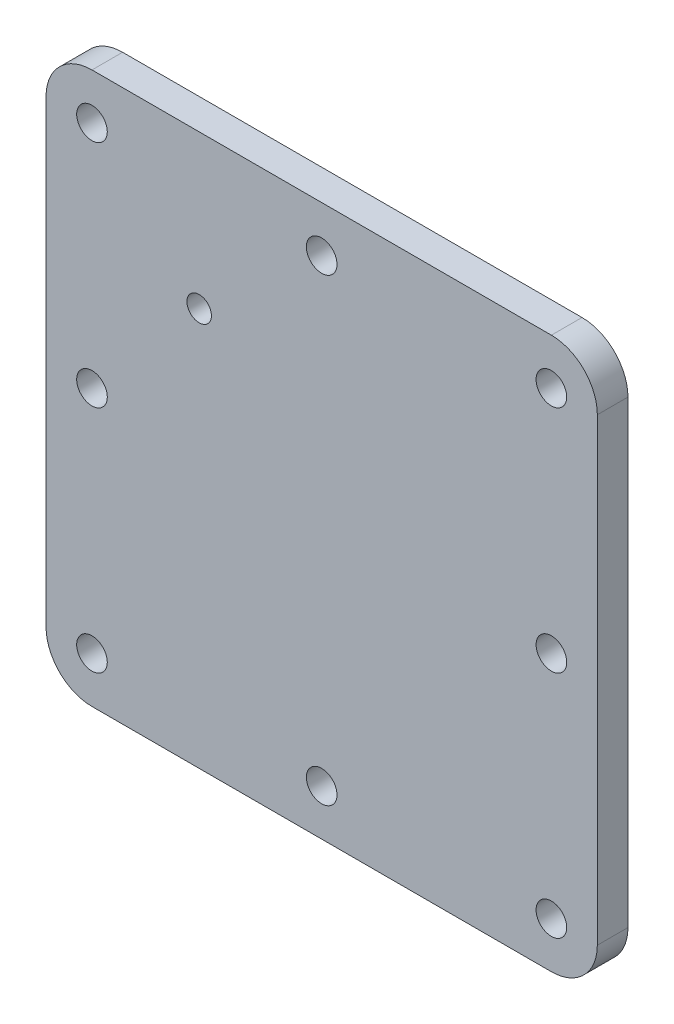
ISO-10303-21;
HEADER;
FILE_DESCRIPTION(('STEP AP214'),'2;1');
FILE_NAME('part.step','',(''),(''),'','','');
FILE_SCHEMA(('AUTOMOTIVE_DESIGN { 1 0 10303 214 1 1 1 1 }'));
ENDSEC;
DATA;
#1=APPLICATION_CONTEXT('core data for automotive mechanical design processes');
#2=APPLICATION_PROTOCOL_DEFINITION('international standard','automotive_design',2000,#1);
#3=PRODUCT_CONTEXT('',#1,'mechanical');
#4=PRODUCT('Part','Part','',(#3));
#5=PRODUCT_RELATED_PRODUCT_CATEGORY('part','',(#4));
#6=PRODUCT_DEFINITION_FORMATION('','',#4);
#7=PRODUCT_DEFINITION_CONTEXT('part definition',#1,'design');
#8=PRODUCT_DEFINITION('design','',#6,#7);
#9=PRODUCT_DEFINITION_SHAPE('','',#8);
#10=(LENGTH_UNIT() NAMED_UNIT(*) SI_UNIT(.MILLI.,.METRE.));
#11=(NAMED_UNIT(*) PLANE_ANGLE_UNIT() SI_UNIT($,.RADIAN.));
#12=(NAMED_UNIT(*) SI_UNIT($,.STERADIAN.) SOLID_ANGLE_UNIT());
#13=UNCERTAINTY_MEASURE_WITH_UNIT(LENGTH_MEASURE(1.E-05),#10,'distance_accuracy_value','');
#14=(GEOMETRIC_REPRESENTATION_CONTEXT(3) GLOBAL_UNCERTAINTY_ASSIGNED_CONTEXT((#13)) GLOBAL_UNIT_ASSIGNED_CONTEXT((#10,
#11,#12)) REPRESENTATION_CONTEXT('',''));
#15=CARTESIAN_POINT('',(0.,0.,0.));
#16=DIRECTION('',(0.,0.,1.));
#17=DIRECTION('',(1.,0.,0.));
#18=AXIS2_PLACEMENT_3D('',#15,#16,#17);
#19=CARTESIAN_POINT('',(-75.,-75.,10.));
#20=DIRECTION('',(0.,0.,1.));
#21=DIRECTION('',(1.,0.,0.));
#22=AXIS2_PLACEMENT_3D('',#19,#20,#21);
#23=PLANE('',#22);
#24=CARTESIAN_POINT('',(-40.,40.,10.));
#25=DIRECTION('',(0.,0.,1.));
#26=DIRECTION('',(1.,0.,0.));
#27=AXIS2_PLACEMENT_3D('',#24,#25,#26);
#28=CIRCLE('',#27,4.);
#29=CARTESIAN_POINT('',(-36.,40.,10.));
#30=VERTEX_POINT('',#29);
#31=EDGE_CURVE('E227',#30,#30,#28,.T.);
#32=ORIENTED_EDGE('',*,*,#31,.F.);
#33=EDGE_LOOP('',(#32));
#34=FACE_BOUND('',#33,.T.);
#35=CARTESIAN_POINT('',(1.54341102686378E-12,-75.,10.));
#36=DIRECTION('',(0.,0.,1.));
#37=DIRECTION('',(1.,0.,0.));
#38=AXIS2_PLACEMENT_3D('',#35,#36,#37);
#39=CIRCLE('',#38,5.);
#40=CARTESIAN_POINT('',(5.00000000000154,-75.,10.));
#41=VERTEX_POINT('',#40);
#42=EDGE_CURVE('E212',#41,#41,#39,.T.);
#43=ORIENTED_EDGE('',*,*,#42,.F.);
#44=EDGE_LOOP('',(#43));
#45=FACE_BOUND('',#44,.T.);
#46=CARTESIAN_POINT('',(75.0000000000008,0.,10.));
#47=DIRECTION('',(0.,0.,1.));
#48=DIRECTION('',(1.,0.,0.));
#49=AXIS2_PLACEMENT_3D('',#46,#47,#48);
#50=CIRCLE('',#49,5.);
#51=CARTESIAN_POINT('',(80.0000000000008,0.,10.));
#52=VERTEX_POINT('',#51);
#53=EDGE_CURVE('E200',#52,#52,#50,.T.);
#54=ORIENTED_EDGE('',*,*,#53,.F.);
#55=EDGE_LOOP('',(#54));
#56=FACE_BOUND('',#55,.T.);
#57=CARTESIAN_POINT('',(75.,75.,10.));
#58=DIRECTION('',(0.,0.,1.));
#59=DIRECTION('',(1.,0.,0.));
#60=AXIS2_PLACEMENT_3D('',#57,#58,#59);
#61=CIRCLE('',#60,5.00000000000001);
#62=CARTESIAN_POINT('',(80.,75.,10.));
#63=VERTEX_POINT('',#62);
#64=EDGE_CURVE('E188',#63,#63,#61,.T.);
#65=ORIENTED_EDGE('',*,*,#64,.F.);
#66=EDGE_LOOP('',(#65));
#67=FACE_BOUND('',#66,.T.);
#68=CARTESIAN_POINT('',(-75.,75.,10.));
#69=DIRECTION('',(0.,0.,1.));
#70=DIRECTION('',(1.,0.,0.));
#71=AXIS2_PLACEMENT_3D('',#68,#69,#70);
#72=CIRCLE('',#71,5.00000000000001);
#73=CARTESIAN_POINT('',(-70.,75.,10.));
#74=VERTEX_POINT('',#73);
#75=EDGE_CURVE('E134',#74,#74,#72,.T.);
#76=ORIENTED_EDGE('',*,*,#75,.F.);
#77=EDGE_LOOP('',(#76));
#78=FACE_BOUND('',#77,.T.);
#79=CARTESIAN_POINT('',(-75.,-75.,10.));
#80=DIRECTION('',(0.,0.,1.));
#81=DIRECTION('',(1.,0.,0.));
#82=AXIS2_PLACEMENT_3D('',#79,#80,#81);
#83=CIRCLE('',#82,15.);
#84=CARTESIAN_POINT('',(-90.,-74.9999999999999,10.));
#85=VERTEX_POINT('',#84);
#86=CARTESIAN_POINT('',(-74.9999999999999,-90.,10.));
#87=VERTEX_POINT('',#86);
#88=EDGE_CURVE('E145',#85,#87,#83,.T.);
#89=ORIENTED_EDGE('',*,*,#88,.T.);
#90=DIRECTION('',(1.,0.,0.));
#91=VECTOR('',#90,1.);
#92=CARTESIAN_POINT('',(-74.9999999999999,-90.,10.));
#93=LINE('',#92,#91);
#94=CARTESIAN_POINT('',(75.,-89.9999999999992,10.));
#95=VERTEX_POINT('',#94);
#96=EDGE_CURVE('E93',#87,#95,#93,.T.);
#97=ORIENTED_EDGE('',*,*,#96,.T.);
#98=CARTESIAN_POINT('',(75.,-74.9999999999992,10.));
#99=DIRECTION('',(0.,0.,1.));
#100=DIRECTION('',(1.,0.,0.));
#101=AXIS2_PLACEMENT_3D('',#98,#99,#100);
#102=CIRCLE('',#101,15.);
#103=CARTESIAN_POINT('',(90.,-75.,10.));
#104=VERTEX_POINT('',#103);
#105=EDGE_CURVE('E160',#95,#104,#102,.T.);
#106=ORIENTED_EDGE('',*,*,#105,.T.);
#107=DIRECTION('',(0.,1.,0.));
#108=VECTOR('',#107,1.);
#109=CARTESIAN_POINT('',(90.,75.0000000000019,10.));
#110=LINE('',#109,#108);
#111=CARTESIAN_POINT('',(90.,75.0000000000019,10.));
#112=VERTEX_POINT('',#111);
#113=EDGE_CURVE('E173',#104,#112,#110,.T.);
#114=ORIENTED_EDGE('',*,*,#113,.T.);
#115=CARTESIAN_POINT('',(75.,75.,10.));
#116=DIRECTION('',(0.,0.,1.));
#117=DIRECTION('',(-1.,0.,0.));
#118=AXIS2_PLACEMENT_3D('',#115,#116,#117);
#119=CIRCLE('',#118,15.);
#120=CARTESIAN_POINT('',(74.9999999999999,90.,10.));
#121=VERTEX_POINT('',#120);
#122=EDGE_CURVE('E112',#112,#121,#119,.T.);
#123=ORIENTED_EDGE('',*,*,#122,.T.);
#124=DIRECTION('',(-1.,0.,0.));
#125=VECTOR('',#124,1.);
#126=CARTESIAN_POINT('',(-74.9999999999999,90.,10.));
#127=LINE('',#126,#125);
#128=CARTESIAN_POINT('',(-74.9999999999999,90.,10.));
#129=VERTEX_POINT('',#128);
#130=EDGE_CURVE('E106',#121,#129,#127,.T.);
#131=ORIENTED_EDGE('',*,*,#130,.T.);
#132=CARTESIAN_POINT('',(-75.,75.,10.));
#133=DIRECTION('',(0.,0.,1.));
#134=DIRECTION('',(1.,0.,0.));
#135=AXIS2_PLACEMENT_3D('',#132,#133,#134);
#136=CIRCLE('',#135,15.);
#137=CARTESIAN_POINT('',(-90.,74.9999999999999,10.));
#138=VERTEX_POINT('',#137);
#139=EDGE_CURVE('E110',#129,#138,#136,.T.);
#140=ORIENTED_EDGE('',*,*,#139,.T.);
#141=DIRECTION('',(0.,-1.,0.));
#142=VECTOR('',#141,1.);
#143=CARTESIAN_POINT('',(-90.,74.9999999999999,10.));
#144=LINE('',#143,#142);
#145=EDGE_CURVE('E50',#138,#85,#144,.T.);
#146=ORIENTED_EDGE('',*,*,#145,.T.);
#147=EDGE_LOOP('',(#89,#97,#106,#114,#123,#131,#140,#146));
#148=FACE_BOUND('',#147,.T.);
#149=CARTESIAN_POINT('',(0.,75.,10.));
#150=DIRECTION('',(0.,0.,1.));
#151=DIRECTION('',(1.,0.,0.));
#152=AXIS2_PLACEMENT_3D('',#149,#150,#151);
#153=CIRCLE('',#152,5.);
#154=CARTESIAN_POINT('',(4.99999999999997,75.,10.));
#155=VERTEX_POINT('',#154);
#156=EDGE_CURVE('E182',#155,#155,#153,.T.);
#157=ORIENTED_EDGE('',*,*,#156,.F.);
#158=EDGE_LOOP('',(#157));
#159=FACE_BOUND('',#158,.T.);
#160=CARTESIAN_POINT('',(-74.9999999999992,0.,10.));
#161=DIRECTION('',(0.,0.,1.));
#162=DIRECTION('',(1.,0.,0.));
#163=AXIS2_PLACEMENT_3D('',#160,#161,#162);
#164=CIRCLE('',#163,5.);
#165=CARTESIAN_POINT('',(-69.9999999999992,0.,10.));
#166=VERTEX_POINT('',#165);
#167=EDGE_CURVE('E194',#166,#166,#164,.T.);
#168=ORIENTED_EDGE('',*,*,#167,.F.);
#169=EDGE_LOOP('',(#168));
#170=FACE_BOUND('',#169,.T.);
#171=CARTESIAN_POINT('',(-74.9999999999985,-75.,10.));
#172=DIRECTION('',(0.,0.,1.));
#173=DIRECTION('',(1.,0.,0.));
#174=AXIS2_PLACEMENT_3D('',#171,#172,#173);
#175=CIRCLE('',#174,5.00000000000001);
#176=CARTESIAN_POINT('',(-69.9999999999985,-75.,10.));
#177=VERTEX_POINT('',#176);
#178=EDGE_CURVE('E206',#177,#177,#175,.T.);
#179=ORIENTED_EDGE('',*,*,#178,.F.);
#180=EDGE_LOOP('',(#179));
#181=FACE_BOUND('',#180,.T.);
#182=CARTESIAN_POINT('',(75.0000000000015,-75.,10.));
#183=DIRECTION('',(0.,0.,1.));
#184=DIRECTION('',(1.,0.,0.));
#185=AXIS2_PLACEMENT_3D('',#182,#183,#184);
#186=CIRCLE('',#185,5.00000000000001);
#187=CARTESIAN_POINT('',(80.0000000000015,-75.,10.));
#188=VERTEX_POINT('',#187);
#189=EDGE_CURVE('E218',#188,#188,#186,.T.);
#190=ORIENTED_EDGE('',*,*,#189,.F.);
#191=EDGE_LOOP('',(#190));
#192=FACE_BOUND('',#191,.T.);
#193=ADVANCED_FACE('F33',(#34,#45,#56,#67,#78,#148,#159,#170,#181,#192),#23,.T.);
#194=CARTESIAN_POINT('',(-75.,-75.,0.));
#195=DIRECTION('',(0.,0.,1.));
#196=DIRECTION('',(1.,0.,0.));
#197=AXIS2_PLACEMENT_3D('',#194,#195,#196);
#198=PLANE('',#197);
#199=CARTESIAN_POINT('',(-40.,40.,0.));
#200=DIRECTION('',(0.,0.,1.));
#201=DIRECTION('',(1.,0.,0.));
#202=AXIS2_PLACEMENT_3D('',#199,#200,#201);
#203=CIRCLE('',#202,4.);
#204=CARTESIAN_POINT('',(-36.,40.,0.));
#205=VERTEX_POINT('',#204);
#206=EDGE_CURVE('E224',#205,#205,#203,.T.);
#207=ORIENTED_EDGE('',*,*,#206,.T.);
#208=EDGE_LOOP('',(#207));
#209=FACE_BOUND('',#208,.T.);
#210=CARTESIAN_POINT('',(-75.,-75.,0.));
#211=DIRECTION('',(0.,0.,1.));
#212=DIRECTION('',(1.,0.,0.));
#213=AXIS2_PLACEMENT_3D('',#210,#211,#212);
#214=CIRCLE('',#213,15.);
#215=CARTESIAN_POINT('',(-90.,-74.9999999999999,0.));
#216=VERTEX_POINT('',#215);
#217=CARTESIAN_POINT('',(-74.9999999999999,-90.,0.));
#218=VERTEX_POINT('',#217);
#219=EDGE_CURVE('E130',#216,#218,#214,.T.);
#220=ORIENTED_EDGE('',*,*,#219,.F.);
#221=DIRECTION('',(0.,-1.,0.));
#222=VECTOR('',#221,1.);
#223=CARTESIAN_POINT('',(-90.,74.9999999999999,0.));
#224=LINE('',#223,#222);
#225=CARTESIAN_POINT('',(-90.,74.9999999999999,0.));
#226=VERTEX_POINT('',#225);
#227=EDGE_CURVE('E85',#226,#216,#224,.T.);
#228=ORIENTED_EDGE('',*,*,#227,.F.);
#229=CARTESIAN_POINT('',(-75.,75.,0.));
#230=DIRECTION('',(0.,0.,1.));
#231=DIRECTION('',(1.,0.,0.));
#232=AXIS2_PLACEMENT_3D('',#229,#230,#231);
#233=CIRCLE('',#232,15.);
#234=CARTESIAN_POINT('',(-74.9999999999999,90.,0.));
#235=VERTEX_POINT('',#234);
#236=EDGE_CURVE('E79',#235,#226,#233,.T.);
#237=ORIENTED_EDGE('',*,*,#236,.F.);
#238=DIRECTION('',(-1.,0.,0.));
#239=VECTOR('',#238,1.);
#240=CARTESIAN_POINT('',(-74.9999999999999,90.,0.));
#241=LINE('',#240,#239);
#242=CARTESIAN_POINT('',(74.9999999999999,90.,0.));
#243=VERTEX_POINT('',#242);
#244=EDGE_CURVE('E120',#243,#235,#241,.T.);
#245=ORIENTED_EDGE('',*,*,#244,.F.);
#246=CARTESIAN_POINT('',(75.,75.,0.));
#247=DIRECTION('',(0.,0.,1.));
#248=DIRECTION('',(-1.,0.,0.));
#249=AXIS2_PLACEMENT_3D('',#246,#247,#248);
#250=CIRCLE('',#249,15.);
#251=CARTESIAN_POINT('',(90.,75.0000000000019,0.));
#252=VERTEX_POINT('',#251);
#253=EDGE_CURVE('E140',#252,#243,#250,.T.);
#254=ORIENTED_EDGE('',*,*,#253,.F.);
#255=DIRECTION('',(0.,1.,0.));
#256=VECTOR('',#255,1.);
#257=CARTESIAN_POINT('',(90.,75.0000000000019,0.));
#258=LINE('',#257,#256);
#259=CARTESIAN_POINT('',(90.,-75.,0.));
#260=VERTEX_POINT('',#259);
#261=EDGE_CURVE('E138',#260,#252,#258,.T.);
#262=ORIENTED_EDGE('',*,*,#261,.F.);
#263=CARTESIAN_POINT('',(75.,-74.9999999999992,0.));
#264=DIRECTION('',(0.,0.,1.));
#265=DIRECTION('',(1.,0.,0.));
#266=AXIS2_PLACEMENT_3D('',#263,#264,#265);
#267=CIRCLE('',#266,15.);
#268=CARTESIAN_POINT('',(75.,-89.9999999999992,0.));
#269=VERTEX_POINT('',#268);
#270=EDGE_CURVE('E136',#269,#260,#267,.T.);
#271=ORIENTED_EDGE('',*,*,#270,.F.);
#272=DIRECTION('',(1.,0.,0.));
#273=VECTOR('',#272,1.);
#274=CARTESIAN_POINT('',(-74.9999999999999,-90.,0.));
#275=LINE('',#274,#273);
#276=EDGE_CURVE('E133',#218,#269,#275,.T.);
#277=ORIENTED_EDGE('',*,*,#276,.F.);
#278=EDGE_LOOP('',(#220,#228,#237,#245,#254,#262,#271,#277));
#279=FACE_BOUND('',#278,.T.);
#280=CARTESIAN_POINT('',(-75.,75.,0.));
#281=DIRECTION('',(0.,0.,1.));
#282=DIRECTION('',(1.,0.,0.));
#283=AXIS2_PLACEMENT_3D('',#280,#281,#282);
#284=CIRCLE('',#283,5.00000000000001);
#285=CARTESIAN_POINT('',(-70.,75.,0.));
#286=VERTEX_POINT('',#285);
#287=EDGE_CURVE('E179',#286,#286,#284,.T.);
#288=ORIENTED_EDGE('',*,*,#287,.T.);
#289=EDGE_LOOP('',(#288));
#290=FACE_BOUND('',#289,.T.);
#291=CARTESIAN_POINT('',(0.,75.,0.));
#292=DIRECTION('',(0.,0.,1.));
#293=DIRECTION('',(1.,0.,0.));
#294=AXIS2_PLACEMENT_3D('',#291,#292,#293);
#295=CIRCLE('',#294,5.);
#296=CARTESIAN_POINT('',(4.99999999999997,75.,0.));
#297=VERTEX_POINT('',#296);
#298=EDGE_CURVE('E185',#297,#297,#295,.T.);
#299=ORIENTED_EDGE('',*,*,#298,.T.);
#300=EDGE_LOOP('',(#299));
#301=FACE_BOUND('',#300,.T.);
#302=CARTESIAN_POINT('',(75.,75.,0.));
#303=DIRECTION('',(0.,0.,1.));
#304=DIRECTION('',(1.,0.,0.));
#305=AXIS2_PLACEMENT_3D('',#302,#303,#304);
#306=CIRCLE('',#305,5.00000000000001);
#307=CARTESIAN_POINT('',(80.,75.,0.));
#308=VERTEX_POINT('',#307);
#309=EDGE_CURVE('E191',#308,#308,#306,.T.);
#310=ORIENTED_EDGE('',*,*,#309,.T.);
#311=EDGE_LOOP('',(#310));
#312=FACE_BOUND('',#311,.T.);
#313=CARTESIAN_POINT('',(-74.9999999999992,0.,0.));
#314=DIRECTION('',(0.,0.,1.));
#315=DIRECTION('',(1.,0.,0.));
#316=AXIS2_PLACEMENT_3D('',#313,#314,#315);
#317=CIRCLE('',#316,5.);
#318=CARTESIAN_POINT('',(-69.9999999999992,0.,0.));
#319=VERTEX_POINT('',#318);
#320=EDGE_CURVE('E197',#319,#319,#317,.T.);
#321=ORIENTED_EDGE('',*,*,#320,.T.);
#322=EDGE_LOOP('',(#321));
#323=FACE_BOUND('',#322,.T.);
#324=CARTESIAN_POINT('',(75.0000000000008,0.,0.));
#325=DIRECTION('',(0.,0.,1.));
#326=DIRECTION('',(1.,0.,0.));
#327=AXIS2_PLACEMENT_3D('',#324,#325,#326);
#328=CIRCLE('',#327,5.);
#329=CARTESIAN_POINT('',(80.0000000000008,0.,0.));
#330=VERTEX_POINT('',#329);
#331=EDGE_CURVE('E203',#330,#330,#328,.T.);
#332=ORIENTED_EDGE('',*,*,#331,.T.);
#333=EDGE_LOOP('',(#332));
#334=FACE_BOUND('',#333,.T.);
#335=CARTESIAN_POINT('',(-74.9999999999985,-75.,0.));
#336=DIRECTION('',(0.,0.,1.));
#337=DIRECTION('',(1.,0.,0.));
#338=AXIS2_PLACEMENT_3D('',#335,#336,#337);
#339=CIRCLE('',#338,5.00000000000001);
#340=CARTESIAN_POINT('',(-69.9999999999985,-75.,0.));
#341=VERTEX_POINT('',#340);
#342=EDGE_CURVE('E209',#341,#341,#339,.T.);
#343=ORIENTED_EDGE('',*,*,#342,.T.);
#344=EDGE_LOOP('',(#343));
#345=FACE_BOUND('',#344,.T.);
#346=CARTESIAN_POINT('',(1.54341102686378E-12,-75.,0.));
#347=DIRECTION('',(0.,0.,1.));
#348=DIRECTION('',(1.,0.,0.));
#349=AXIS2_PLACEMENT_3D('',#346,#347,#348);
#350=CIRCLE('',#349,5.);
#351=CARTESIAN_POINT('',(5.00000000000154,-75.,0.));
#352=VERTEX_POINT('',#351);
#353=EDGE_CURVE('E215',#352,#352,#350,.T.);
#354=ORIENTED_EDGE('',*,*,#353,.T.);
#355=EDGE_LOOP('',(#354));
#356=FACE_BOUND('',#355,.T.);
#357=CARTESIAN_POINT('',(75.0000000000015,-75.,0.));
#358=DIRECTION('',(0.,0.,1.));
#359=DIRECTION('',(1.,0.,0.));
#360=AXIS2_PLACEMENT_3D('',#357,#358,#359);
#361=CIRCLE('',#360,5.00000000000001);
#362=CARTESIAN_POINT('',(80.0000000000015,-75.,0.));
#363=VERTEX_POINT('',#362);
#364=EDGE_CURVE('E221',#363,#363,#361,.T.);
#365=ORIENTED_EDGE('',*,*,#364,.T.);
#366=EDGE_LOOP('',(#365));
#367=FACE_BOUND('',#366,.T.);
#368=ADVANCED_FACE('F164',(#209,#279,#290,#301,#312,#323,#334,#345,#356,#367),#198,.F.);
#369=CARTESIAN_POINT('',(-75.,-75.,10.));
#370=DIRECTION('',(0.,0.,-1.));
#371=DIRECTION('',(-1.,0.,0.));
#372=AXIS2_PLACEMENT_3D('',#369,#370,#371);
#373=CYLINDRICAL_SURFACE('',#372,15.);
#374=ORIENTED_EDGE('',*,*,#219,.T.);
#375=DIRECTION('',(0.,0.,-1.));
#376=VECTOR('',#375,1.);
#377=CARTESIAN_POINT('',(-74.9999999999999,-90.,10.));
#378=LINE('',#377,#376);
#379=EDGE_CURVE('E11',#87,#218,#378,.T.);
#380=ORIENTED_EDGE('',*,*,#379,.F.);
#381=ORIENTED_EDGE('',*,*,#88,.F.);
#382=DIRECTION('',(0.,0.,-1.));
#383=VECTOR('',#382,1.);
#384=CARTESIAN_POINT('',(-90.,-74.9999999999999,10.));
#385=LINE('',#384,#383);
#386=EDGE_CURVE('E126',#85,#216,#385,.T.);
#387=ORIENTED_EDGE('',*,*,#386,.T.);
#388=EDGE_LOOP('',(#374,#380,#381,#387));
#389=FACE_BOUND('',#388,.T.);
#390=ADVANCED_FACE('F35',(#389),#373,.T.);
#391=CARTESIAN_POINT('',(-74.9999999999999,-90.,10.));
#392=DIRECTION('',(0.,1.,0.));
#393=DIRECTION('',(-1.,0.,0.));
#394=AXIS2_PLACEMENT_3D('',#391,#392,#393);
#395=PLANE('',#394);
#396=ORIENTED_EDGE('',*,*,#276,.T.);
#397=DIRECTION('',(0.,0.,-1.));
#398=VECTOR('',#397,1.);
#399=CARTESIAN_POINT('',(75.,-89.9999999999992,10.));
#400=LINE('',#399,#398);
#401=EDGE_CURVE('E42',#95,#269,#400,.T.);
#402=ORIENTED_EDGE('',*,*,#401,.F.);
#403=ORIENTED_EDGE('',*,*,#96,.F.);
#404=ORIENTED_EDGE('',*,*,#379,.T.);
#405=EDGE_LOOP('',(#396,#402,#403,#404));
#406=FACE_BOUND('',#405,.T.);
#407=ADVANCED_FACE('F316',(#406),#395,.F.);
#408=CARTESIAN_POINT('',(75.,-74.9999999999992,10.));
#409=DIRECTION('',(0.,0.,-1.));
#410=DIRECTION('',(-1.,0.,0.));
#411=AXIS2_PLACEMENT_3D('',#408,#409,#410);
#412=CYLINDRICAL_SURFACE('',#411,15.);
#413=ORIENTED_EDGE('',*,*,#270,.T.);
#414=DIRECTION('',(0.,0.,-1.));
#415=VECTOR('',#414,1.);
#416=CARTESIAN_POINT('',(90.,-75.,10.));
#417=LINE('',#416,#415);
#418=EDGE_CURVE('E152',#104,#260,#417,.T.);
#419=ORIENTED_EDGE('',*,*,#418,.F.);
#420=ORIENTED_EDGE('',*,*,#105,.F.);
#421=ORIENTED_EDGE('',*,*,#401,.T.);
#422=EDGE_LOOP('',(#413,#419,#420,#421));
#423=FACE_BOUND('',#422,.T.);
#424=ADVANCED_FACE('F158',(#423),#412,.T.);
#425=CARTESIAN_POINT('',(90.,75.0000000000019,10.));
#426=DIRECTION('',(-1.,0.,0.));
#427=DIRECTION('',(0.,-1.,0.));
#428=AXIS2_PLACEMENT_3D('',#425,#426,#427);
#429=PLANE('',#428);
#430=ORIENTED_EDGE('',*,*,#261,.T.);
#431=DIRECTION('',(0.,0.,-1.));
#432=VECTOR('',#431,1.);
#433=CARTESIAN_POINT('',(90.,75.0000000000019,10.));
#434=LINE('',#433,#432);
#435=EDGE_CURVE('E149',#112,#252,#434,.T.);
#436=ORIENTED_EDGE('',*,*,#435,.F.);
#437=ORIENTED_EDGE('',*,*,#113,.F.);
#438=ORIENTED_EDGE('',*,*,#418,.T.);
#439=EDGE_LOOP('',(#430,#436,#437,#438));
#440=FACE_BOUND('',#439,.T.);
#441=ADVANCED_FACE('F169',(#440),#429,.F.);
#442=CARTESIAN_POINT('',(75.,75.,10.));
#443=DIRECTION('',(0.,0.,-1.));
#444=DIRECTION('',(-1.,0.,0.));
#445=AXIS2_PLACEMENT_3D('',#442,#443,#444);
#446=CYLINDRICAL_SURFACE('',#445,15.);
#447=ORIENTED_EDGE('',*,*,#253,.T.);
#448=DIRECTION('',(0.,0.,-1.));
#449=VECTOR('',#448,1.);
#450=CARTESIAN_POINT('',(74.9999999999999,90.,10.));
#451=LINE('',#450,#449);
#452=EDGE_CURVE('E121',#121,#243,#451,.T.);
#453=ORIENTED_EDGE('',*,*,#452,.F.);
#454=ORIENTED_EDGE('',*,*,#122,.F.);
#455=ORIENTED_EDGE('',*,*,#435,.T.);
#456=EDGE_LOOP('',(#447,#453,#454,#455));
#457=FACE_BOUND('',#456,.T.);
#458=ADVANCED_FACE('F172',(#457),#446,.T.);
#459=CARTESIAN_POINT('',(-74.9999999999999,90.,10.));
#460=DIRECTION('',(0.,-1.,0.));
#461=DIRECTION('',(0.,0.,-1.));
#462=AXIS2_PLACEMENT_3D('',#459,#460,#461);
#463=PLANE('',#462);
#464=ORIENTED_EDGE('',*,*,#244,.T.);
#465=DIRECTION('',(0.,0.,-1.));
#466=VECTOR('',#465,1.);
#467=CARTESIAN_POINT('',(-74.9999999999999,90.,10.));
#468=LINE('',#467,#466);
#469=EDGE_CURVE('E117',#129,#235,#468,.T.);
#470=ORIENTED_EDGE('',*,*,#469,.F.);
#471=ORIENTED_EDGE('',*,*,#130,.F.);
#472=ORIENTED_EDGE('',*,*,#452,.T.);
#473=EDGE_LOOP('',(#464,#470,#471,#472));
#474=FACE_BOUND('',#473,.T.);
#475=ADVANCED_FACE('F118',(#474),#463,.F.);
#476=CARTESIAN_POINT('',(-75.,75.,10.));
#477=DIRECTION('',(0.,0.,-1.));
#478=DIRECTION('',(-1.,0.,0.));
#479=AXIS2_PLACEMENT_3D('',#476,#477,#478);
#480=CYLINDRICAL_SURFACE('',#479,15.);
#481=ORIENTED_EDGE('',*,*,#236,.T.);
#482=DIRECTION('',(0.,0.,-1.));
#483=VECTOR('',#482,1.);
#484=CARTESIAN_POINT('',(-90.,74.9999999999999,10.));
#485=LINE('',#484,#483);
#486=EDGE_CURVE('E122',#138,#226,#485,.T.);
#487=ORIENTED_EDGE('',*,*,#486,.F.);
#488=ORIENTED_EDGE('',*,*,#139,.F.);
#489=ORIENTED_EDGE('',*,*,#469,.T.);
#490=EDGE_LOOP('',(#481,#487,#488,#489));
#491=FACE_BOUND('',#490,.T.);
#492=ADVANCED_FACE('F124',(#491),#480,.T.);
#493=CARTESIAN_POINT('',(-90.,74.9999999999999,10.));
#494=DIRECTION('',(1.,0.,0.));
#495=DIRECTION('',(0.,1.,0.));
#496=AXIS2_PLACEMENT_3D('',#493,#494,#495);
#497=PLANE('',#496);
#498=ORIENTED_EDGE('',*,*,#227,.T.);
#499=ORIENTED_EDGE('',*,*,#386,.F.);
#500=ORIENTED_EDGE('',*,*,#145,.F.);
#501=ORIENTED_EDGE('',*,*,#486,.T.);
#502=EDGE_LOOP('',(#498,#499,#500,#501));
#503=FACE_BOUND('',#502,.T.);
#504=ADVANCED_FACE('F256',(#503),#497,.F.);
#505=CARTESIAN_POINT('',(-75.,75.,10.));
#506=DIRECTION('',(0.,0.,-1.));
#507=DIRECTION('',(-1.,0.,0.));
#508=AXIS2_PLACEMENT_3D('',#505,#506,#507);
#509=CYLINDRICAL_SURFACE('',#508,5.00000000000001);
#510=ORIENTED_EDGE('',*,*,#75,.T.);
#511=EDGE_LOOP('',(#510));
#512=FACE_BOUND('',#511,.T.);
#513=ORIENTED_EDGE('',*,*,#287,.F.);
#514=EDGE_LOOP('',(#513));
#515=FACE_BOUND('',#514,.T.);
#516=ADVANCED_FACE('F252',(#512,#515),#509,.F.);
#517=CARTESIAN_POINT('',(0.,75.,10.));
#518=DIRECTION('',(0.,0.,-1.));
#519=DIRECTION('',(-1.,0.,0.));
#520=AXIS2_PLACEMENT_3D('',#517,#518,#519);
#521=CYLINDRICAL_SURFACE('',#520,5.);
#522=ORIENTED_EDGE('',*,*,#156,.T.);
#523=EDGE_LOOP('',(#522));
#524=FACE_BOUND('',#523,.T.);
#525=ORIENTED_EDGE('',*,*,#298,.F.);
#526=EDGE_LOOP('',(#525));
#527=FACE_BOUND('',#526,.T.);
#528=ADVANCED_FACE('F255',(#524,#527),#521,.F.);
#529=CARTESIAN_POINT('',(75.,75.,10.));
#530=DIRECTION('',(0.,0.,-1.));
#531=DIRECTION('',(-1.,0.,0.));
#532=AXIS2_PLACEMENT_3D('',#529,#530,#531);
#533=CYLINDRICAL_SURFACE('',#532,5.00000000000001);
#534=ORIENTED_EDGE('',*,*,#64,.T.);
#535=EDGE_LOOP('',(#534));
#536=FACE_BOUND('',#535,.T.);
#537=ORIENTED_EDGE('',*,*,#309,.F.);
#538=EDGE_LOOP('',(#537));
#539=FACE_BOUND('',#538,.T.);
#540=ADVANCED_FACE('F297',(#536,#539),#533,.F.);
#541=CARTESIAN_POINT('',(-74.9999999999992,0.,10.));
#542=DIRECTION('',(0.,0.,-1.));
#543=DIRECTION('',(-1.,0.,0.));
#544=AXIS2_PLACEMENT_3D('',#541,#542,#543);
#545=CYLINDRICAL_SURFACE('',#544,5.);
#546=ORIENTED_EDGE('',*,*,#167,.T.);
#547=EDGE_LOOP('',(#546));
#548=FACE_BOUND('',#547,.T.);
#549=ORIENTED_EDGE('',*,*,#320,.F.);
#550=EDGE_LOOP('',(#549));
#551=FACE_BOUND('',#550,.T.);
#552=ADVANCED_FACE('F293',(#548,#551),#545,.F.);
#553=CARTESIAN_POINT('',(75.0000000000008,0.,10.));
#554=DIRECTION('',(0.,0.,-1.));
#555=DIRECTION('',(-1.,0.,0.));
#556=AXIS2_PLACEMENT_3D('',#553,#554,#555);
#557=CYLINDRICAL_SURFACE('',#556,5.);
#558=ORIENTED_EDGE('',*,*,#53,.T.);
#559=EDGE_LOOP('',(#558));
#560=FACE_BOUND('',#559,.T.);
#561=ORIENTED_EDGE('',*,*,#331,.F.);
#562=EDGE_LOOP('',(#561));
#563=FACE_BOUND('',#562,.T.);
#564=ADVANCED_FACE('F289',(#560,#563),#557,.F.);
#565=CARTESIAN_POINT('',(-74.9999999999985,-75.,10.));
#566=DIRECTION('',(0.,0.,-1.));
#567=DIRECTION('',(-1.,0.,0.));
#568=AXIS2_PLACEMENT_3D('',#565,#566,#567);
#569=CYLINDRICAL_SURFACE('',#568,5.00000000000001);
#570=ORIENTED_EDGE('',*,*,#178,.T.);
#571=EDGE_LOOP('',(#570));
#572=FACE_BOUND('',#571,.T.);
#573=ORIENTED_EDGE('',*,*,#342,.F.);
#574=EDGE_LOOP('',(#573));
#575=FACE_BOUND('',#574,.T.);
#576=ADVANCED_FACE('F283',(#572,#575),#569,.F.);
#577=CARTESIAN_POINT('',(1.54341102686378E-12,-75.,10.));
#578=DIRECTION('',(0.,0.,-1.));
#579=DIRECTION('',(-1.,0.,0.));
#580=AXIS2_PLACEMENT_3D('',#577,#578,#579);
#581=CYLINDRICAL_SURFACE('',#580,5.);
#582=ORIENTED_EDGE('',*,*,#42,.T.);
#583=EDGE_LOOP('',(#582));
#584=FACE_BOUND('',#583,.T.);
#585=ORIENTED_EDGE('',*,*,#353,.F.);
#586=EDGE_LOOP('',(#585));
#587=FACE_BOUND('',#586,.T.);
#588=ADVANCED_FACE('F277',(#584,#587),#581,.F.);
#589=CARTESIAN_POINT('',(75.0000000000015,-75.,10.));
#590=DIRECTION('',(0.,0.,-1.));
#591=DIRECTION('',(-1.,0.,0.));
#592=AXIS2_PLACEMENT_3D('',#589,#590,#591);
#593=CYLINDRICAL_SURFACE('',#592,5.00000000000001);
#594=ORIENTED_EDGE('',*,*,#189,.T.);
#595=EDGE_LOOP('',(#594));
#596=FACE_BOUND('',#595,.T.);
#597=ORIENTED_EDGE('',*,*,#364,.F.);
#598=EDGE_LOOP('',(#597));
#599=FACE_BOUND('',#598,.T.);
#600=ADVANCED_FACE('F237',(#596,#599),#593,.F.);
#601=CARTESIAN_POINT('',(-40.,40.,0.));
#602=DIRECTION('',(0.,0.,1.));
#603=DIRECTION('',(1.,0.,0.));
#604=AXIS2_PLACEMENT_3D('',#601,#602,#603);
#605=CYLINDRICAL_SURFACE('',#604,4.);
#606=ORIENTED_EDGE('',*,*,#206,.F.);
#607=EDGE_LOOP('',(#606));
#608=FACE_BOUND('',#607,.T.);
#609=ORIENTED_EDGE('',*,*,#31,.T.);
#610=EDGE_LOOP('',(#609));
#611=FACE_BOUND('',#610,.T.);
#612=ADVANCED_FACE('F234',(#608,#611),#605,.F.);
#613=CLOSED_SHELL('',(#193,#368,#390,#407,#424,#441,#458,#475,#492,#504,#516,#528,#540,#552,
#564,#576,#588,#600,#612));
#614=MANIFOLD_SOLID_BREP('B2',#613);
#615=ADVANCED_BREP_SHAPE_REPRESENTATION('',(#18,#614),#14);
#616=SHAPE_DEFINITION_REPRESENTATION(#9,#615);
ENDSEC;
END-ISO-10303-21;
